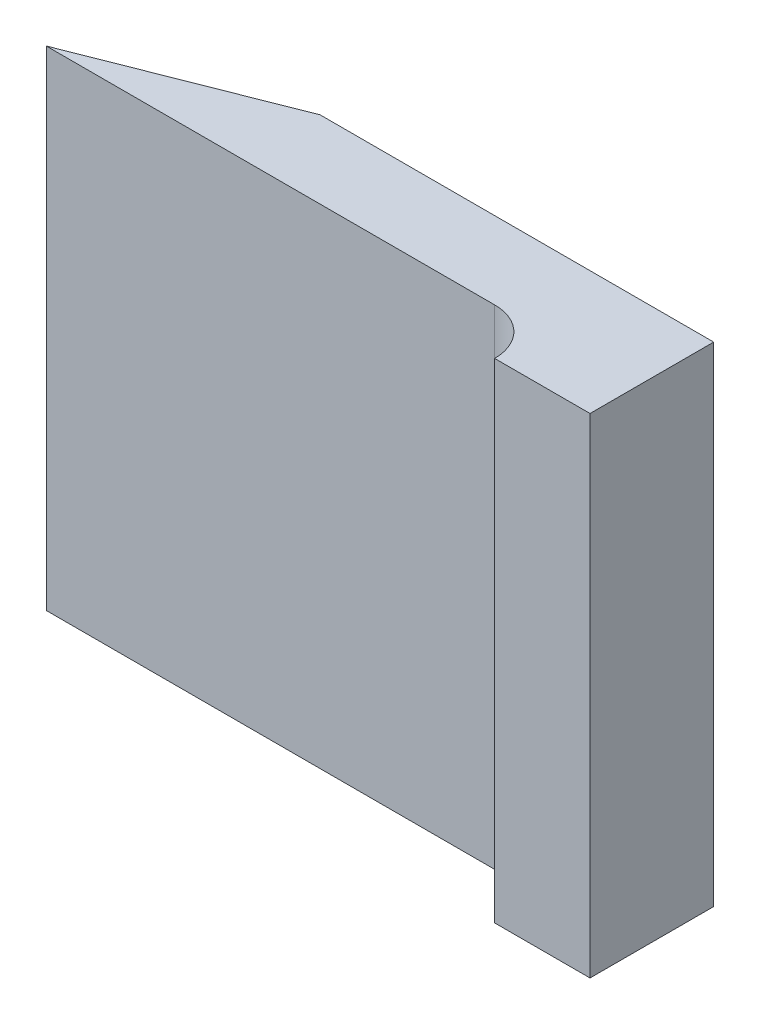
ISO-10303-21;
HEADER;
FILE_DESCRIPTION(('STEP AP214'),'2;1');
FILE_NAME('part.step','',(''),(''),'','','');
FILE_SCHEMA(('AUTOMOTIVE_DESIGN { 1 0 10303 214 1 1 1 1 }'));
ENDSEC;
DATA;
#1=APPLICATION_CONTEXT('core data for automotive mechanical design processes');
#2=APPLICATION_PROTOCOL_DEFINITION('international standard','automotive_design',2000,#1);
#3=PRODUCT_CONTEXT('',#1,'mechanical');
#4=PRODUCT('Part','Part','',(#3));
#5=PRODUCT_RELATED_PRODUCT_CATEGORY('part','',(#4));
#6=PRODUCT_DEFINITION_FORMATION('','',#4);
#7=PRODUCT_DEFINITION_CONTEXT('part definition',#1,'design');
#8=PRODUCT_DEFINITION('design','',#6,#7);
#9=PRODUCT_DEFINITION_SHAPE('','',#8);
#10=(LENGTH_UNIT() NAMED_UNIT(*) SI_UNIT(.MILLI.,.METRE.));
#11=(NAMED_UNIT(*) PLANE_ANGLE_UNIT() SI_UNIT($,.RADIAN.));
#12=(NAMED_UNIT(*) SI_UNIT($,.STERADIAN.) SOLID_ANGLE_UNIT());
#13=UNCERTAINTY_MEASURE_WITH_UNIT(LENGTH_MEASURE(1.E-05),#10,'distance_accuracy_value','');
#14=(GEOMETRIC_REPRESENTATION_CONTEXT(3) GLOBAL_UNCERTAINTY_ASSIGNED_CONTEXT((#13)) GLOBAL_UNIT_ASSIGNED_CONTEXT((#10,
#11,#12)) REPRESENTATION_CONTEXT('',''));
#15=CARTESIAN_POINT('',(0.,0.,0.));
#16=DIRECTION('',(0.,0.,1.));
#17=DIRECTION('',(1.,0.,0.));
#18=AXIS2_PLACEMENT_3D('',#15,#16,#17);
#19=CARTESIAN_POINT('',(30.1208814917553,34.7898569372217,12.7));
#20=DIRECTION('',(0.,-1.,0.));
#21=DIRECTION('',(1.,0.,0.));
#22=AXIS2_PLACEMENT_3D('',#19,#20,#21);
#23=PLANE('',#22);
#24=DIRECTION('',(-1.,0.,0.));
#25=VECTOR('',#24,1.);
#26=CARTESIAN_POINT('',(30.1208814917553,34.7898569372217,0.));
#27=LINE('',#26,#25);
#28=CARTESIAN_POINT('',(30.1208814917553,34.7898569372217,0.));
#29=VERTEX_POINT('',#28);
#30=CARTESIAN_POINT('',(-2.2101949859999,34.7898569372216,0.));
#31=VERTEX_POINT('',#30);
#32=EDGE_CURVE('E111',#29,#31,#27,.T.);
#33=ORIENTED_EDGE('',*,*,#32,.T.);
#34=DIRECTION('',(0.930581538358996,0.,-0.366084690290928));
#35=VECTOR('',#34,1.);
#36=CARTESIAN_POINT('',(-18.3517953459701,34.7898569372216,6.35));
#37=LINE('',#36,#35);
#38=CARTESIAN_POINT('',(-18.3517953459701,34.7898569372216,6.35));
#39=VERTEX_POINT('',#38);
#40=EDGE_CURVE('E96',#39,#31,#37,.T.);
#41=ORIENTED_EDGE('',*,*,#40,.F.);
#42=DIRECTION('',(-1.,0.,0.));
#43=VECTOR('',#42,1.);
#44=CARTESIAN_POINT('',(-18.3517953459701,34.7898569372216,6.35));
#45=LINE('',#44,#43);
#46=CARTESIAN_POINT('',(18.4782046540299,34.7898569372216,6.35));
#47=VERTEX_POINT('',#46);
#48=EDGE_CURVE('E109',#47,#39,#45,.T.);
#49=ORIENTED_EDGE('',*,*,#48,.F.);
#50=CARTESIAN_POINT('',(18.4782046540299,34.7898569372217,10.16));
#51=DIRECTION('',(0.,-1.,0.));
#52=DIRECTION('',(1.,0.,0.));
#53=AXIS2_PLACEMENT_3D('',#50,#51,#52);
#54=CIRCLE('',#53,3.81);
#55=CARTESIAN_POINT('',(22.2882046540299,34.7898569372216,10.16));
#56=VERTEX_POINT('',#55);
#57=EDGE_CURVE('E49',#56,#47,#54,.F.);
#58=ORIENTED_EDGE('',*,*,#57,.F.);
#59=DIRECTION('',(-1.,0.,0.));
#60=VECTOR('',#59,1.);
#61=CARTESIAN_POINT('',(22.2882046540299,34.7898569372216,10.16));
#62=LINE('',#61,#60);
#63=CARTESIAN_POINT('',(30.1208814917553,34.7898569372216,10.16));
#64=VERTEX_POINT('',#63);
#65=EDGE_CURVE('E104',#64,#56,#62,.T.);
#66=ORIENTED_EDGE('',*,*,#65,.F.);
#67=DIRECTION('',(0.,0.,-1.));
#68=VECTOR('',#67,1.);
#69=CARTESIAN_POINT('',(30.1208814917553,34.7898569372217,12.7));
#70=LINE('',#69,#68);
#71=EDGE_CURVE('E125',#64,#29,#70,.T.);
#72=ORIENTED_EDGE('',*,*,#71,.T.);
#73=EDGE_LOOP('',(#33,#41,#49,#58,#66,#72));
#74=FACE_BOUND('',#73,.T.);
#75=ADVANCED_FACE('F41',(#74),#23,.F.);
#76=CARTESIAN_POINT('',(-18.3517953459701,-5.3679630708281,12.7));
#77=DIRECTION('',(0.,1.,0.));
#78=DIRECTION('',(0.,0.,1.));
#79=AXIS2_PLACEMENT_3D('',#76,#77,#78);
#80=PLANE('',#79);
#81=DIRECTION('',(1.,0.,0.));
#82=VECTOR('',#81,1.);
#83=CARTESIAN_POINT('',(-18.3517953459701,-5.3679630708281,6.35));
#84=LINE('',#83,#82);
#85=CARTESIAN_POINT('',(-18.3517953459701,-5.3679630708281,6.35));
#86=VERTEX_POINT('',#85);
#87=CARTESIAN_POINT('',(18.4782046540299,-5.3679630708281,6.35));
#88=VERTEX_POINT('',#87);
#89=EDGE_CURVE('E103',#86,#88,#84,.T.);
#90=ORIENTED_EDGE('',*,*,#89,.F.);
#91=DIRECTION('',(0.930581538358996,0.,-0.366084690290928));
#92=VECTOR('',#91,1.);
#93=CARTESIAN_POINT('',(-20.515060350525,-5.3679630708281,7.20101430295532));
#94=LINE('',#93,#92);
#95=CARTESIAN_POINT('',(-2.2101949859999,-5.3679630708281,0.));
#96=VERTEX_POINT('',#95);
#97=EDGE_CURVE('E99',#86,#96,#94,.T.);
#98=ORIENTED_EDGE('',*,*,#97,.T.);
#99=DIRECTION('',(1.,0.,0.));
#100=VECTOR('',#99,1.);
#101=CARTESIAN_POINT('',(-18.3517953459701,-5.3679630708281,0.));
#102=LINE('',#101,#100);
#103=CARTESIAN_POINT('',(30.1208814917553,-5.3679630708281,0.));
#104=VERTEX_POINT('',#103);
#105=EDGE_CURVE('E117',#96,#104,#102,.T.);
#106=ORIENTED_EDGE('',*,*,#105,.T.);
#107=DIRECTION('',(0.,0.,-1.));
#108=VECTOR('',#107,1.);
#109=CARTESIAN_POINT('',(30.1208814917553,-5.3679630708281,12.7));
#110=LINE('',#109,#108);
#111=CARTESIAN_POINT('',(30.1208814917553,-5.3679630708281,10.16));
#112=VERTEX_POINT('',#111);
#113=EDGE_CURVE('E127',#112,#104,#110,.T.);
#114=ORIENTED_EDGE('',*,*,#113,.F.);
#115=DIRECTION('',(1.,0.,0.));
#116=VECTOR('',#115,1.);
#117=CARTESIAN_POINT('',(22.2882046540299,-5.3679630708281,10.16));
#118=LINE('',#117,#116);
#119=CARTESIAN_POINT('',(22.2882046540299,-5.3679630708281,10.16));
#120=VERTEX_POINT('',#119);
#121=EDGE_CURVE('E134',#120,#112,#118,.T.);
#122=ORIENTED_EDGE('',*,*,#121,.F.);
#123=CARTESIAN_POINT('',(18.4782046540299,-5.3679630708281,10.16));
#124=DIRECTION('',(0.,1.,0.));
#125=DIRECTION('',(0.,0.,1.));
#126=AXIS2_PLACEMENT_3D('',#123,#124,#125);
#127=CIRCLE('',#126,3.81);
#128=EDGE_CURVE('E11',#88,#120,#127,.F.);
#129=ORIENTED_EDGE('',*,*,#128,.F.);
#130=EDGE_LOOP('',(#90,#98,#106,#114,#122,#129));
#131=FACE_BOUND('',#130,.T.);
#132=ADVANCED_FACE('F138',(#131),#80,.F.);
#133=CARTESIAN_POINT('',(30.1208814917553,-5.3679630708281,12.7));
#134=DIRECTION('',(-1.,0.,0.));
#135=DIRECTION('',(0.,-1.,0.));
#136=AXIS2_PLACEMENT_3D('',#133,#134,#135);
#137=PLANE('',#136);
#138=DIRECTION('',(0.,1.,0.));
#139=VECTOR('',#138,1.);
#140=CARTESIAN_POINT('',(30.1208814917553,34.7898569372216,10.16));
#141=LINE('',#140,#139);
#142=EDGE_CURVE('E139',#112,#64,#141,.T.);
#143=ORIENTED_EDGE('',*,*,#142,.F.);
#144=ORIENTED_EDGE('',*,*,#113,.T.);
#145=DIRECTION('',(0.,1.,0.));
#146=VECTOR('',#145,1.);
#147=CARTESIAN_POINT('',(30.1208814917553,-5.3679630708281,0.));
#148=LINE('',#147,#146);
#149=EDGE_CURVE('E122',#104,#29,#148,.T.);
#150=ORIENTED_EDGE('',*,*,#149,.T.);
#151=ORIENTED_EDGE('',*,*,#71,.F.);
#152=EDGE_LOOP('',(#143,#144,#150,#151));
#153=FACE_BOUND('',#152,.T.);
#154=ADVANCED_FACE('F148',(#153),#137,.F.);
#155=CARTESIAN_POINT('',(18.4782046540299,34.7898569372216,10.16));
#156=DIRECTION('',(0.,-1.,0.));
#157=DIRECTION('',(1.,0.,0.));
#158=AXIS2_PLACEMENT_3D('',#155,#156,#157);
#159=CYLINDRICAL_SURFACE('',#158,3.81);
#160=DIRECTION('',(0.,-1.,0.));
#161=VECTOR('',#160,1.);
#162=CARTESIAN_POINT('',(22.2882046540299,34.7898569372216,10.16));
#163=LINE('',#162,#161);
#164=EDGE_CURVE('E130',#56,#120,#163,.T.);
#165=ORIENTED_EDGE('',*,*,#164,.F.);
#166=ORIENTED_EDGE('',*,*,#57,.T.);
#167=DIRECTION('',(0.,-1.,0.));
#168=VECTOR('',#167,1.);
#169=CARTESIAN_POINT('',(18.4782046540299,0.,6.35));
#170=LINE('',#169,#168);
#171=EDGE_CURVE('E115',#88,#47,#170,.F.);
#172=ORIENTED_EDGE('',*,*,#171,.F.);
#173=ORIENTED_EDGE('',*,*,#128,.T.);
#174=EDGE_LOOP('',(#165,#166,#172,#173));
#175=FACE_BOUND('',#174,.T.);
#176=ADVANCED_FACE('F43',(#175),#159,.F.);
#177=CARTESIAN_POINT('',(0.,0.,0.));
#178=DIRECTION('',(0.,0.,1.));
#179=DIRECTION('',(1.,0.,0.));
#180=AXIS2_PLACEMENT_3D('',#177,#178,#179);
#181=PLANE('',#180);
#182=ORIENTED_EDGE('',*,*,#105,.F.);
#183=DIRECTION('',(0.,1.,0.));
#184=VECTOR('',#183,1.);
#185=CARTESIAN_POINT('',(-2.2101949859999,-94.7501430627783,0.));
#186=LINE('',#185,#184);
#187=EDGE_CURVE('E112',#96,#31,#186,.T.);
#188=ORIENTED_EDGE('',*,*,#187,.T.);
#189=ORIENTED_EDGE('',*,*,#32,.F.);
#190=ORIENTED_EDGE('',*,*,#149,.F.);
#191=EDGE_LOOP('',(#182,#188,#189,#190));
#192=FACE_BOUND('',#191,.T.);
#193=ADVANCED_FACE('F145',(#192),#181,.F.);
#194=CARTESIAN_POINT('',(0.,0.,6.35));
#195=DIRECTION('',(0.,0.,1.));
#196=DIRECTION('',(1.,0.,0.));
#197=AXIS2_PLACEMENT_3D('',#194,#195,#196);
#198=PLANE('',#197);
#199=ORIENTED_EDGE('',*,*,#89,.T.);
#200=ORIENTED_EDGE('',*,*,#171,.T.);
#201=ORIENTED_EDGE('',*,*,#48,.T.);
#202=DIRECTION('',(0.,-1.,0.));
#203=VECTOR('',#202,1.);
#204=CARTESIAN_POINT('',(-18.3517953459701,34.7898569372216,6.35));
#205=LINE('',#204,#203);
#206=EDGE_CURVE('E93',#39,#86,#205,.T.);
#207=ORIENTED_EDGE('',*,*,#206,.T.);
#208=EDGE_LOOP('',(#199,#200,#201,#207));
#209=FACE_BOUND('',#208,.T.);
#210=ADVANCED_FACE('F114',(#209),#198,.T.);
#211=CARTESIAN_POINT('',(0.,0.,10.16));
#212=DIRECTION('',(0.,0.,1.));
#213=DIRECTION('',(1.,0.,0.));
#214=AXIS2_PLACEMENT_3D('',#211,#212,#213);
#215=PLANE('',#214);
#216=ORIENTED_EDGE('',*,*,#164,.T.);
#217=ORIENTED_EDGE('',*,*,#121,.T.);
#218=ORIENTED_EDGE('',*,*,#142,.T.);
#219=ORIENTED_EDGE('',*,*,#65,.T.);
#220=EDGE_LOOP('',(#216,#217,#218,#219));
#221=FACE_BOUND('',#220,.T.);
#222=ADVANCED_FACE('F133',(#221),#215,.T.);
#223=CARTESIAN_POINT('',(-18.3517953459701,-94.7501430627783,6.35));
#224=DIRECTION('',(0.366084690290928,0.,0.930581538358996));
#225=DIRECTION('',(0.930581538358996,0.,-0.366084690290928));
#226=AXIS2_PLACEMENT_3D('',#223,#224,#225);
#227=PLANE('',#226);
#228=ORIENTED_EDGE('',*,*,#206,.F.);
#229=ORIENTED_EDGE('',*,*,#40,.T.);
#230=ORIENTED_EDGE('',*,*,#187,.F.);
#231=ORIENTED_EDGE('',*,*,#97,.F.);
#232=EDGE_LOOP('',(#228,#229,#230,#231));
#233=FACE_BOUND('',#232,.T.);
#234=ADVANCED_FACE('F95',(#233),#227,.F.);
#235=CLOSED_SHELL('',(#75,#132,#154,#176,#193,#210,#222,#234));
#236=MANIFOLD_SOLID_BREP('B2',#235);
#237=ADVANCED_BREP_SHAPE_REPRESENTATION('',(#18,#236),#14);
#238=SHAPE_DEFINITION_REPRESENTATION(#9,#237);
ENDSEC;
END-ISO-10303-21;
